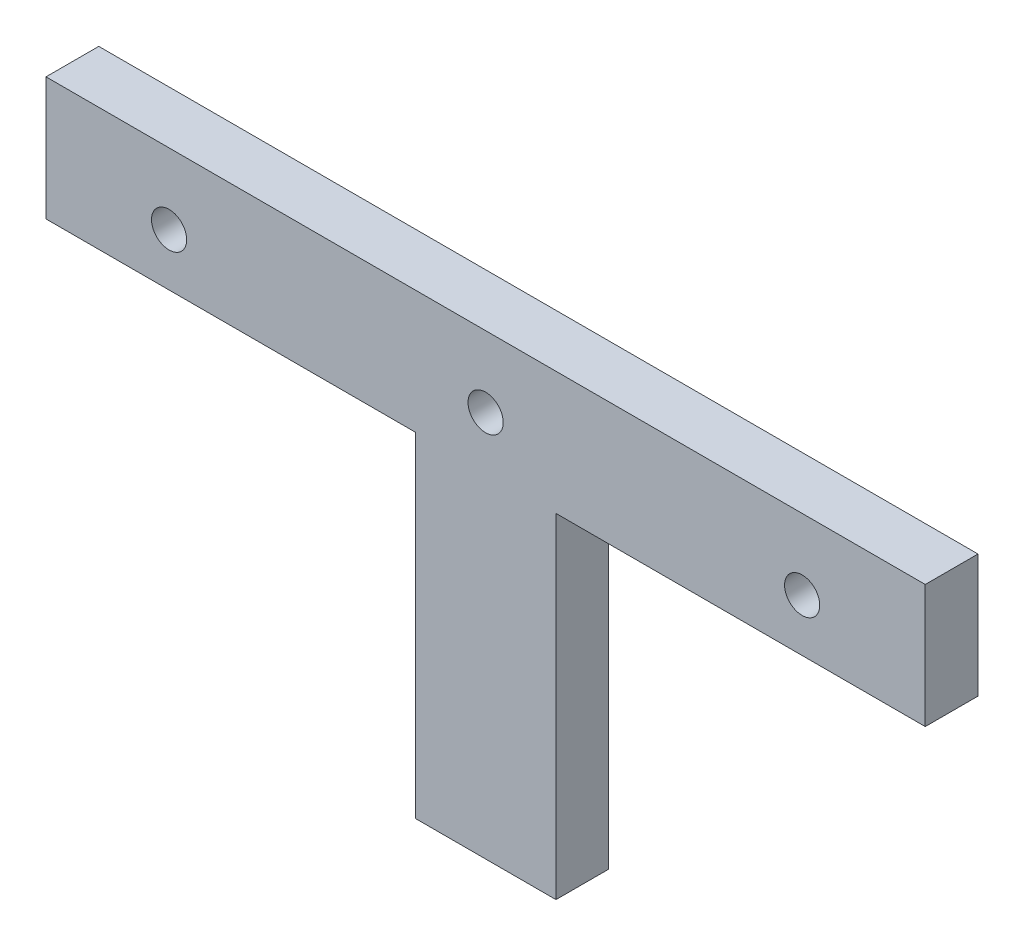
ISO-10303-21;
HEADER;
FILE_DESCRIPTION(('STEP AP214'),'2;1');
FILE_NAME('part.step','',(''),(''),'','','');
FILE_SCHEMA(('AUTOMOTIVE_DESIGN { 1 0 10303 214 1 1 1 1 }'));
ENDSEC;
DATA;
#1=APPLICATION_CONTEXT('core data for automotive mechanical design processes');
#2=APPLICATION_PROTOCOL_DEFINITION('international standard','automotive_design',2000,#1);
#3=PRODUCT_CONTEXT('',#1,'mechanical');
#4=PRODUCT('Part','Part','',(#3));
#5=PRODUCT_RELATED_PRODUCT_CATEGORY('part','',(#4));
#6=PRODUCT_DEFINITION_FORMATION('','',#4);
#7=PRODUCT_DEFINITION_CONTEXT('part definition',#1,'design');
#8=PRODUCT_DEFINITION('design','',#6,#7);
#9=PRODUCT_DEFINITION_SHAPE('','',#8);
#10=(LENGTH_UNIT() NAMED_UNIT(*) SI_UNIT(.MILLI.,.METRE.));
#11=(NAMED_UNIT(*) PLANE_ANGLE_UNIT() SI_UNIT($,.RADIAN.));
#12=(NAMED_UNIT(*) SI_UNIT($,.STERADIAN.) SOLID_ANGLE_UNIT());
#13=UNCERTAINTY_MEASURE_WITH_UNIT(LENGTH_MEASURE(1.E-05),#10,'distance_accuracy_value','');
#14=(GEOMETRIC_REPRESENTATION_CONTEXT(3) GLOBAL_UNCERTAINTY_ASSIGNED_CONTEXT((#13)) GLOBAL_UNIT_ASSIGNED_CONTEXT((#10,
#11,#12)) REPRESENTATION_CONTEXT('',''));
#15=CARTESIAN_POINT('',(0.,0.,0.));
#16=DIRECTION('',(0.,0.,1.));
#17=DIRECTION('',(1.,0.,0.));
#18=AXIS2_PLACEMENT_3D('',#15,#16,#17);
#19=CARTESIAN_POINT('',(-15.1551410613989,102.329702578108,15.));
#20=DIRECTION('',(-1.,0.,0.));
#21=DIRECTION('',(0.,-1.,0.));
#22=AXIS2_PLACEMENT_3D('',#19,#20,#21);
#23=PLANE('',#22);
#24=DIRECTION('',(0.,1.,0.));
#25=VECTOR('',#24,1.);
#26=CARTESIAN_POINT('',(-15.1551410613989,102.329702578108,0.));
#27=LINE('',#26,#25);
#28=CARTESIAN_POINT('',(-15.1551410613989,7.21961406259204,0.));
#29=VERTEX_POINT('',#28);
#30=CARTESIAN_POINT('',(-15.1551410613989,102.329702578108,0.));
#31=VERTEX_POINT('',#30);
#32=EDGE_CURVE('E129',#29,#31,#27,.T.);
#33=ORIENTED_EDGE('',*,*,#32,.T.);
#34=DIRECTION('',(0.,0.,-1.));
#35=VECTOR('',#34,1.);
#36=CARTESIAN_POINT('',(-15.1551410613989,102.329702578108,15.));
#37=LINE('',#36,#35);
#38=CARTESIAN_POINT('',(-15.1551410613989,102.329702578108,15.));
#39=VERTEX_POINT('',#38);
#40=EDGE_CURVE('E11',#39,#31,#37,.T.);
#41=ORIENTED_EDGE('',*,*,#40,.F.);
#42=DIRECTION('',(0.,1.,0.));
#43=VECTOR('',#42,1.);
#44=CARTESIAN_POINT('',(-15.1551410613989,102.329702578108,15.));
#45=LINE('',#44,#43);
#46=CARTESIAN_POINT('',(-15.1551410613989,7.21961406259204,15.));
#47=VERTEX_POINT('',#46);
#48=EDGE_CURVE('E144',#47,#39,#45,.T.);
#49=ORIENTED_EDGE('',*,*,#48,.F.);
#50=DIRECTION('',(0.,0.,-1.));
#51=VECTOR('',#50,1.);
#52=CARTESIAN_POINT('',(-15.1551410613989,7.21961406259204,15.));
#53=LINE('',#52,#51);
#54=EDGE_CURVE('E125',#47,#29,#53,.T.);
#55=ORIENTED_EDGE('',*,*,#54,.T.);
#56=EDGE_LOOP('',(#33,#41,#49,#55));
#57=FACE_BOUND('',#56,.T.);
#58=ADVANCED_FACE('F33',(#57),#23,.F.);
#59=CARTESIAN_POINT('',(89.8448589386011,102.329702578108,15.));
#60=DIRECTION('',(0.,1.,0.));
#61=DIRECTION('',(-1.,0.,0.));
#62=AXIS2_PLACEMENT_3D('',#59,#60,#61);
#63=PLANE('',#62);
#64=DIRECTION('',(1.,0.,0.));
#65=VECTOR('',#64,1.);
#66=CARTESIAN_POINT('',(89.8448589386011,102.329702578108,0.));
#67=LINE('',#66,#65);
#68=CARTESIAN_POINT('',(89.8448589386011,102.329702578108,0.));
#69=VERTEX_POINT('',#68);
#70=EDGE_CURVE('E132',#31,#69,#67,.T.);
#71=ORIENTED_EDGE('',*,*,#70,.T.);
#72=DIRECTION('',(0.,0.,-1.));
#73=VECTOR('',#72,1.);
#74=CARTESIAN_POINT('',(89.8448589386011,102.329702578108,15.));
#75=LINE('',#74,#73);
#76=CARTESIAN_POINT('',(89.8448589386011,102.329702578108,15.));
#77=VERTEX_POINT('',#76);
#78=EDGE_CURVE('E41',#77,#69,#75,.T.);
#79=ORIENTED_EDGE('',*,*,#78,.F.);
#80=DIRECTION('',(1.,0.,0.));
#81=VECTOR('',#80,1.);
#82=CARTESIAN_POINT('',(89.8448589386011,102.329702578108,15.));
#83=LINE('',#82,#81);
#84=EDGE_CURVE('E92',#39,#77,#83,.T.);
#85=ORIENTED_EDGE('',*,*,#84,.F.);
#86=ORIENTED_EDGE('',*,*,#40,.T.);
#87=EDGE_LOOP('',(#71,#79,#85,#86));
#88=FACE_BOUND('',#87,.T.);
#89=ADVANCED_FACE('F225',(#88),#63,.F.);
#90=CARTESIAN_POINT('',(89.8448589386011,137.329702578108,15.));
#91=DIRECTION('',(-1.,0.,0.));
#92=DIRECTION('',(0.,-1.,0.));
#93=AXIS2_PLACEMENT_3D('',#90,#91,#92);
#94=PLANE('',#93);
#95=DIRECTION('',(0.,1.,0.));
#96=VECTOR('',#95,1.);
#97=CARTESIAN_POINT('',(89.8448589386011,137.329702578108,0.));
#98=LINE('',#97,#96);
#99=CARTESIAN_POINT('',(89.8448589386011,137.329702578108,0.));
#100=VERTEX_POINT('',#99);
#101=EDGE_CURVE('E135',#69,#100,#98,.T.);
#102=ORIENTED_EDGE('',*,*,#101,.T.);
#103=DIRECTION('',(0.,0.,-1.));
#104=VECTOR('',#103,1.);
#105=CARTESIAN_POINT('',(89.8448589386011,137.329702578108,15.));
#106=LINE('',#105,#104);
#107=CARTESIAN_POINT('',(89.8448589386011,137.329702578108,15.));
#108=VERTEX_POINT('',#107);
#109=EDGE_CURVE('E151',#108,#100,#106,.T.);
#110=ORIENTED_EDGE('',*,*,#109,.F.);
#111=DIRECTION('',(0.,1.,0.));
#112=VECTOR('',#111,1.);
#113=CARTESIAN_POINT('',(89.8448589386011,137.329702578108,15.));
#114=LINE('',#113,#112);
#115=EDGE_CURVE('E159',#77,#108,#114,.T.);
#116=ORIENTED_EDGE('',*,*,#115,.F.);
#117=ORIENTED_EDGE('',*,*,#78,.T.);
#118=EDGE_LOOP('',(#102,#110,#116,#117));
#119=FACE_BOUND('',#118,.T.);
#120=ADVANCED_FACE('F157',(#119),#94,.F.);
#121=CARTESIAN_POINT('',(-160.155141061399,137.329702578108,15.));
#122=DIRECTION('',(0.,-1.,0.));
#123=DIRECTION('',(0.,0.,-1.));
#124=AXIS2_PLACEMENT_3D('',#121,#122,#123);
#125=PLANE('',#124);
#126=DIRECTION('',(-1.,0.,0.));
#127=VECTOR('',#126,1.);
#128=CARTESIAN_POINT('',(-160.155141061399,137.329702578108,0.));
#129=LINE('',#128,#127);
#130=CARTESIAN_POINT('',(-160.155141061399,137.329702578108,0.));
#131=VERTEX_POINT('',#130);
#132=EDGE_CURVE('E137',#100,#131,#129,.T.);
#133=ORIENTED_EDGE('',*,*,#132,.T.);
#134=DIRECTION('',(0.,0.,-1.));
#135=VECTOR('',#134,1.);
#136=CARTESIAN_POINT('',(-160.155141061399,137.329702578108,15.));
#137=LINE('',#136,#135);
#138=CARTESIAN_POINT('',(-160.155141061399,137.329702578108,15.));
#139=VERTEX_POINT('',#138);
#140=EDGE_CURVE('E148',#139,#131,#137,.T.);
#141=ORIENTED_EDGE('',*,*,#140,.F.);
#142=DIRECTION('',(-1.,0.,0.));
#143=VECTOR('',#142,1.);
#144=CARTESIAN_POINT('',(-160.155141061399,137.329702578108,15.));
#145=LINE('',#144,#143);
#146=EDGE_CURVE('E171',#108,#139,#145,.T.);
#147=ORIENTED_EDGE('',*,*,#146,.F.);
#148=ORIENTED_EDGE('',*,*,#109,.T.);
#149=EDGE_LOOP('',(#133,#141,#147,#148));
#150=FACE_BOUND('',#149,.T.);
#151=ADVANCED_FACE('F167',(#150),#125,.F.);
#152=CARTESIAN_POINT('',(-160.155141061399,102.329702578108,15.));
#153=DIRECTION('',(1.,0.,0.));
#154=DIRECTION('',(0.,1.,0.));
#155=AXIS2_PLACEMENT_3D('',#152,#153,#154);
#156=PLANE('',#155);
#157=DIRECTION('',(0.,-1.,0.));
#158=VECTOR('',#157,1.);
#159=CARTESIAN_POINT('',(-160.155141061399,102.329702578108,0.));
#160=LINE('',#159,#158);
#161=CARTESIAN_POINT('',(-160.155141061399,102.329702578108,0.));
#162=VERTEX_POINT('',#161);
#163=EDGE_CURVE('E139',#131,#162,#160,.T.);
#164=ORIENTED_EDGE('',*,*,#163,.T.);
#165=DIRECTION('',(0.,0.,-1.));
#166=VECTOR('',#165,1.);
#167=CARTESIAN_POINT('',(-160.155141061399,102.329702578108,15.));
#168=LINE('',#167,#166);
#169=CARTESIAN_POINT('',(-160.155141061399,102.329702578108,15.));
#170=VERTEX_POINT('',#169);
#171=EDGE_CURVE('E120',#170,#162,#168,.T.);
#172=ORIENTED_EDGE('',*,*,#171,.F.);
#173=DIRECTION('',(0.,-1.,0.));
#174=VECTOR('',#173,1.);
#175=CARTESIAN_POINT('',(-160.155141061399,102.329702578108,15.));
#176=LINE('',#175,#174);
#177=EDGE_CURVE('E111',#139,#170,#176,.T.);
#178=ORIENTED_EDGE('',*,*,#177,.F.);
#179=ORIENTED_EDGE('',*,*,#140,.T.);
#180=EDGE_LOOP('',(#164,#172,#178,#179));
#181=FACE_BOUND('',#180,.T.);
#182=ADVANCED_FACE('F170',(#181),#156,.F.);
#183=CARTESIAN_POINT('',(-55.1551410613989,102.329702578108,15.));
#184=DIRECTION('',(0.,1.,0.));
#185=DIRECTION('',(-1.,0.,0.));
#186=AXIS2_PLACEMENT_3D('',#183,#184,#185);
#187=PLANE('',#186);
#188=DIRECTION('',(1.,0.,0.));
#189=VECTOR('',#188,1.);
#190=CARTESIAN_POINT('',(-55.1551410613989,102.329702578108,0.));
#191=LINE('',#190,#189);
#192=CARTESIAN_POINT('',(-55.1551410613989,102.329702578108,0.));
#193=VERTEX_POINT('',#192);
#194=EDGE_CURVE('E119',#162,#193,#191,.T.);
#195=ORIENTED_EDGE('',*,*,#194,.T.);
#196=DIRECTION('',(0.,0.,-1.));
#197=VECTOR('',#196,1.);
#198=CARTESIAN_POINT('',(-55.1551410613989,102.329702578108,15.));
#199=LINE('',#198,#197);
#200=CARTESIAN_POINT('',(-55.1551410613989,102.329702578108,15.));
#201=VERTEX_POINT('',#200);
#202=EDGE_CURVE('E116',#201,#193,#199,.T.);
#203=ORIENTED_EDGE('',*,*,#202,.F.);
#204=DIRECTION('',(1.,0.,0.));
#205=VECTOR('',#204,1.);
#206=CARTESIAN_POINT('',(-55.1551410613989,102.329702578108,15.));
#207=LINE('',#206,#205);
#208=EDGE_CURVE('E105',#170,#201,#207,.T.);
#209=ORIENTED_EDGE('',*,*,#208,.F.);
#210=ORIENTED_EDGE('',*,*,#171,.T.);
#211=EDGE_LOOP('',(#195,#203,#209,#210));
#212=FACE_BOUND('',#211,.T.);
#213=ADVANCED_FACE('F117',(#212),#187,.F.);
#214=CARTESIAN_POINT('',(-55.1551410613989,7.21961406259203,15.));
#215=DIRECTION('',(1.,0.,0.));
#216=DIRECTION('',(0.,1.,0.));
#217=AXIS2_PLACEMENT_3D('',#214,#215,#216);
#218=PLANE('',#217);
#219=DIRECTION('',(0.,-1.,0.));
#220=VECTOR('',#219,1.);
#221=CARTESIAN_POINT('',(-55.1551410613989,7.21961406259203,0.));
#222=LINE('',#221,#220);
#223=CARTESIAN_POINT('',(-55.1551410613989,7.21961406259203,0.));
#224=VERTEX_POINT('',#223);
#225=EDGE_CURVE('E78',#193,#224,#222,.T.);
#226=ORIENTED_EDGE('',*,*,#225,.T.);
#227=DIRECTION('',(0.,0.,-1.));
#228=VECTOR('',#227,1.);
#229=CARTESIAN_POINT('',(-55.1551410613989,7.21961406259203,15.));
#230=LINE('',#229,#228);
#231=CARTESIAN_POINT('',(-55.1551410613989,7.21961406259203,15.));
#232=VERTEX_POINT('',#231);
#233=EDGE_CURVE('E121',#232,#224,#230,.T.);
#234=ORIENTED_EDGE('',*,*,#233,.F.);
#235=DIRECTION('',(0.,-1.,0.));
#236=VECTOR('',#235,1.);
#237=CARTESIAN_POINT('',(-55.1551410613989,7.21961406259203,15.));
#238=LINE('',#237,#236);
#239=EDGE_CURVE('E109',#201,#232,#238,.T.);
#240=ORIENTED_EDGE('',*,*,#239,.F.);
#241=ORIENTED_EDGE('',*,*,#202,.T.);
#242=EDGE_LOOP('',(#226,#234,#240,#241));
#243=FACE_BOUND('',#242,.T.);
#244=ADVANCED_FACE('F123',(#243),#218,.F.);
#245=CARTESIAN_POINT('',(-15.1551410613989,7.21961406259204,15.));
#246=DIRECTION('',(0.,1.,0.));
#247=DIRECTION('',(-1.,0.,0.));
#248=AXIS2_PLACEMENT_3D('',#245,#246,#247);
#249=PLANE('',#248);
#250=DIRECTION('',(1.,0.,0.));
#251=VECTOR('',#250,1.);
#252=CARTESIAN_POINT('',(-15.1551410613989,7.21961406259204,0.));
#253=LINE('',#252,#251);
#254=EDGE_CURVE('E84',#224,#29,#253,.T.);
#255=ORIENTED_EDGE('',*,*,#254,.T.);
#256=ORIENTED_EDGE('',*,*,#54,.F.);
#257=DIRECTION('',(1.,0.,0.));
#258=VECTOR('',#257,1.);
#259=CARTESIAN_POINT('',(-15.1551410613989,7.21961406259204,15.));
#260=LINE('',#259,#258);
#261=EDGE_CURVE('E49',#232,#47,#260,.T.);
#262=ORIENTED_EDGE('',*,*,#261,.F.);
#263=ORIENTED_EDGE('',*,*,#233,.T.);
#264=EDGE_LOOP('',(#255,#256,#262,#263));
#265=FACE_BOUND('',#264,.T.);
#266=ADVANCED_FACE('F206',(#265),#249,.F.);
#267=CARTESIAN_POINT('',(0.,0.,15.));
#268=DIRECTION('',(0.,0.,-1.));
#269=DIRECTION('',(-1.,0.,0.));
#270=AXIS2_PLACEMENT_3D('',#267,#268,#269);
#271=PLANE('',#270);
#272=CARTESIAN_POINT('',(54.8448589386011,117.189491535266,15.));
#273=DIRECTION('',(0.,0.,1.));
#274=DIRECTION('',(1.,0.,0.));
#275=AXIS2_PLACEMENT_3D('',#272,#273,#274);
#276=CIRCLE('',#275,5.00000000000001);
#277=CARTESIAN_POINT('',(59.8448589386011,117.189491535266,15.));
#278=VERTEX_POINT('',#277);
#279=EDGE_CURVE('E189',#278,#278,#276,.T.);
#280=ORIENTED_EDGE('',*,*,#279,.F.);
#281=EDGE_LOOP('',(#280));
#282=FACE_BOUND('',#281,.T.);
#283=CARTESIAN_POINT('',(-35.1551410613989,117.189491535266,15.));
#284=DIRECTION('',(0.,0.,1.));
#285=DIRECTION('',(1.,0.,0.));
#286=AXIS2_PLACEMENT_3D('',#283,#284,#285);
#287=CIRCLE('',#286,5.);
#288=CARTESIAN_POINT('',(-30.1551410613989,117.189491535266,15.));
#289=VERTEX_POINT('',#288);
#290=EDGE_CURVE('E183',#289,#289,#287,.T.);
#291=ORIENTED_EDGE('',*,*,#290,.F.);
#292=EDGE_LOOP('',(#291));
#293=FACE_BOUND('',#292,.T.);
#294=CARTESIAN_POINT('',(-125.155141061399,117.189491535266,15.));
#295=DIRECTION('',(0.,0.,1.));
#296=DIRECTION('',(1.,0.,0.));
#297=AXIS2_PLACEMENT_3D('',#294,#295,#296);
#298=CIRCLE('',#297,4.99999999999999);
#299=CARTESIAN_POINT('',(-120.155141061399,117.189491535266,15.));
#300=VERTEX_POINT('',#299);
#301=EDGE_CURVE('E177',#300,#300,#298,.T.);
#302=ORIENTED_EDGE('',*,*,#301,.F.);
#303=EDGE_LOOP('',(#302));
#304=FACE_BOUND('',#303,.T.);
#305=ORIENTED_EDGE('',*,*,#48,.T.);
#306=ORIENTED_EDGE('',*,*,#84,.T.);
#307=ORIENTED_EDGE('',*,*,#115,.T.);
#308=ORIENTED_EDGE('',*,*,#146,.T.);
#309=ORIENTED_EDGE('',*,*,#177,.T.);
#310=ORIENTED_EDGE('',*,*,#208,.T.);
#311=ORIENTED_EDGE('',*,*,#239,.T.);
#312=ORIENTED_EDGE('',*,*,#261,.T.);
#313=EDGE_LOOP('',(#305,#306,#307,#308,#309,#310,#311,#312));
#314=FACE_BOUND('',#313,.T.);
#315=ADVANCED_FACE('F107',(#282,#293,#304,#314),#271,.F.);
#316=CARTESIAN_POINT('',(0.,0.,0.));
#317=DIRECTION('',(0.,0.,-1.));
#318=DIRECTION('',(-1.,0.,0.));
#319=AXIS2_PLACEMENT_3D('',#316,#317,#318);
#320=PLANE('',#319);
#321=CARTESIAN_POINT('',(54.8448589386011,117.189491535266,0.));
#322=DIRECTION('',(0.,0.,1.));
#323=DIRECTION('',(1.,0.,0.));
#324=AXIS2_PLACEMENT_3D('',#321,#322,#323);
#325=CIRCLE('',#324,5.00000000000001);
#326=CARTESIAN_POINT('',(59.8448589386011,117.189491535266,0.));
#327=VERTEX_POINT('',#326);
#328=EDGE_CURVE('E133',#327,#327,#325,.T.);
#329=ORIENTED_EDGE('',*,*,#328,.T.);
#330=EDGE_LOOP('',(#329));
#331=FACE_BOUND('',#330,.T.);
#332=CARTESIAN_POINT('',(-35.1551410613989,117.189491535266,0.));
#333=DIRECTION('',(0.,0.,1.));
#334=DIRECTION('',(1.,0.,0.));
#335=AXIS2_PLACEMENT_3D('',#332,#333,#334);
#336=CIRCLE('',#335,5.);
#337=CARTESIAN_POINT('',(-30.1551410613989,117.189491535266,0.));
#338=VERTEX_POINT('',#337);
#339=EDGE_CURVE('E186',#338,#338,#336,.T.);
#340=ORIENTED_EDGE('',*,*,#339,.T.);
#341=EDGE_LOOP('',(#340));
#342=FACE_BOUND('',#341,.T.);
#343=CARTESIAN_POINT('',(-125.155141061399,117.189491535266,0.));
#344=DIRECTION('',(0.,0.,1.));
#345=DIRECTION('',(1.,0.,0.));
#346=AXIS2_PLACEMENT_3D('',#343,#344,#345);
#347=CIRCLE('',#346,4.99999999999999);
#348=CARTESIAN_POINT('',(-120.155141061399,117.189491535266,0.));
#349=VERTEX_POINT('',#348);
#350=EDGE_CURVE('E180',#349,#349,#347,.T.);
#351=ORIENTED_EDGE('',*,*,#350,.T.);
#352=EDGE_LOOP('',(#351));
#353=FACE_BOUND('',#352,.T.);
#354=ORIENTED_EDGE('',*,*,#32,.F.);
#355=ORIENTED_EDGE('',*,*,#254,.F.);
#356=ORIENTED_EDGE('',*,*,#225,.F.);
#357=ORIENTED_EDGE('',*,*,#194,.F.);
#358=ORIENTED_EDGE('',*,*,#163,.F.);
#359=ORIENTED_EDGE('',*,*,#132,.F.);
#360=ORIENTED_EDGE('',*,*,#101,.F.);
#361=ORIENTED_EDGE('',*,*,#70,.F.);
#362=EDGE_LOOP('',(#354,#355,#356,#357,#358,#359,#360,#361));
#363=FACE_BOUND('',#362,.T.);
#364=ADVANCED_FACE('F163',(#331,#342,#353,#363),#320,.T.);
#365=CARTESIAN_POINT('',(-125.155141061399,117.189491535266,0.));
#366=DIRECTION('',(0.,0.,1.));
#367=DIRECTION('',(1.,0.,0.));
#368=AXIS2_PLACEMENT_3D('',#365,#366,#367);
#369=CYLINDRICAL_SURFACE('',#368,4.99999999999999);
#370=ORIENTED_EDGE('',*,*,#350,.F.);
#371=EDGE_LOOP('',(#370));
#372=FACE_BOUND('',#371,.T.);
#373=ORIENTED_EDGE('',*,*,#301,.T.);
#374=EDGE_LOOP('',(#373));
#375=FACE_BOUND('',#374,.T.);
#376=ADVANCED_FACE('F212',(#372,#375),#369,.F.);
#377=CARTESIAN_POINT('',(-35.1551410613989,117.189491535266,0.));
#378=DIRECTION('',(0.,0.,1.));
#379=DIRECTION('',(1.,0.,0.));
#380=AXIS2_PLACEMENT_3D('',#377,#378,#379);
#381=CYLINDRICAL_SURFACE('',#380,5.);
#382=ORIENTED_EDGE('',*,*,#339,.F.);
#383=EDGE_LOOP('',(#382));
#384=FACE_BOUND('',#383,.T.);
#385=ORIENTED_EDGE('',*,*,#290,.T.);
#386=EDGE_LOOP('',(#385));
#387=FACE_BOUND('',#386,.T.);
#388=ADVANCED_FACE('F200',(#384,#387),#381,.F.);
#389=CARTESIAN_POINT('',(54.8448589386011,117.189491535266,0.));
#390=DIRECTION('',(0.,0.,1.));
#391=DIRECTION('',(1.,0.,0.));
#392=AXIS2_PLACEMENT_3D('',#389,#390,#391);
#393=CYLINDRICAL_SURFACE('',#392,5.00000000000001);
#394=ORIENTED_EDGE('',*,*,#328,.F.);
#395=EDGE_LOOP('',(#394));
#396=FACE_BOUND('',#395,.T.);
#397=ORIENTED_EDGE('',*,*,#279,.T.);
#398=EDGE_LOOP('',(#397));
#399=FACE_BOUND('',#398,.T.);
#400=ADVANCED_FACE('F197',(#396,#399),#393,.F.);
#401=CLOSED_SHELL('',(#58,#89,#120,#151,#182,#213,#244,#266,#315,#364,#376,#388,#400));
#402=MANIFOLD_SOLID_BREP('B2',#401);
#403=ADVANCED_BREP_SHAPE_REPRESENTATION('',(#18,#402),#14);
#404=SHAPE_DEFINITION_REPRESENTATION(#9,#403);
ENDSEC;
END-ISO-10303-21;
